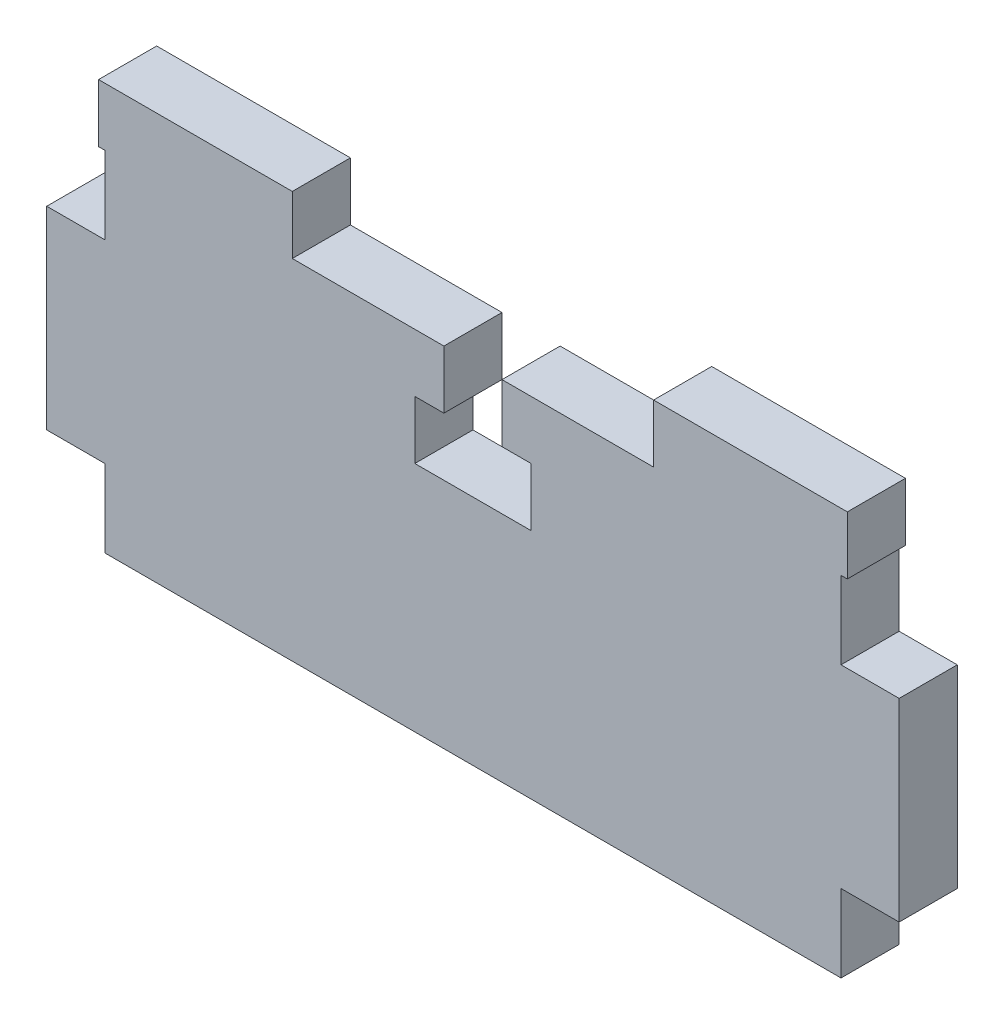
ISO-10303-21;
HEADER;
FILE_DESCRIPTION(('STEP AP214'),'2;1');
FILE_NAME('part.step','',(''),(''),'','','');
FILE_SCHEMA(('AUTOMOTIVE_DESIGN { 1 0 10303 214 1 1 1 1 }'));
ENDSEC;
DATA;
#1=APPLICATION_CONTEXT('core data for automotive mechanical design processes');
#2=APPLICATION_PROTOCOL_DEFINITION('international standard','automotive_design',2000,#1);
#3=PRODUCT_CONTEXT('',#1,'mechanical');
#4=PRODUCT('Part','Part','',(#3));
#5=PRODUCT_RELATED_PRODUCT_CATEGORY('part','',(#4));
#6=PRODUCT_DEFINITION_FORMATION('','',#4);
#7=PRODUCT_DEFINITION_CONTEXT('part definition',#1,'design');
#8=PRODUCT_DEFINITION('design','',#6,#7);
#9=PRODUCT_DEFINITION_SHAPE('','',#8);
#10=(LENGTH_UNIT() NAMED_UNIT(*) SI_UNIT(.MILLI.,.METRE.));
#11=(NAMED_UNIT(*) PLANE_ANGLE_UNIT() SI_UNIT($,.RADIAN.));
#12=(NAMED_UNIT(*) SI_UNIT($,.STERADIAN.) SOLID_ANGLE_UNIT());
#13=UNCERTAINTY_MEASURE_WITH_UNIT(LENGTH_MEASURE(1.E-05),#10,'distance_accuracy_value','');
#14=(GEOMETRIC_REPRESENTATION_CONTEXT(3) GLOBAL_UNCERTAINTY_ASSIGNED_CONTEXT((#13)) GLOBAL_UNIT_ASSIGNED_CONTEXT((#10,
#11,#12)) REPRESENTATION_CONTEXT('',''));
#15=CARTESIAN_POINT('',(0.,0.,0.));
#16=DIRECTION('',(0.,0.,1.));
#17=DIRECTION('',(1.,0.,0.));
#18=AXIS2_PLACEMENT_3D('',#15,#16,#17);
#19=CARTESIAN_POINT('',(-19.,-9.00000000000001,3.));
#20=DIRECTION('',(1.,0.,0.));
#21=DIRECTION('',(0.,1.,0.));
#22=AXIS2_PLACEMENT_3D('',#19,#20,#21);
#23=PLANE('',#22);
#24=DIRECTION('',(0.,-1.,0.));
#25=VECTOR('',#24,1.);
#26=CARTESIAN_POINT('',(-19.,-9.00000000000001,0.));
#27=LINE('',#26,#25);
#28=CARTESIAN_POINT('',(-19.,9.,0.));
#29=VERTEX_POINT('',#28);
#30=CARTESIAN_POINT('',(-19.,5.00000000000009,0.));
#31=VERTEX_POINT('',#30);
#32=EDGE_CURVE('E380',#29,#31,#27,.T.);
#33=ORIENTED_EDGE('',*,*,#32,.T.);
#34=DIRECTION('',(0.,0.,1.));
#35=VECTOR('',#34,1.);
#36=CARTESIAN_POINT('',(-19.,5.00000000000009,3.));
#37=LINE('',#36,#35);
#38=CARTESIAN_POINT('',(-19.,5.00000000000009,3.));
#39=VERTEX_POINT('',#38);
#40=EDGE_CURVE('E269',#31,#39,#37,.T.);
#41=ORIENTED_EDGE('',*,*,#40,.T.);
#42=DIRECTION('',(0.,-1.,0.));
#43=VECTOR('',#42,1.);
#44=CARTESIAN_POINT('',(-19.,-9.00000000000001,3.));
#45=LINE('',#44,#43);
#46=CARTESIAN_POINT('',(-19.,8.99999999999999,3.));
#47=VERTEX_POINT('',#46);
#48=EDGE_CURVE('E352',#47,#39,#45,.T.);
#49=ORIENTED_EDGE('',*,*,#48,.F.);
#50=DIRECTION('',(0.,0.,-1.));
#51=VECTOR('',#50,1.);
#52=CARTESIAN_POINT('',(-19.,8.99999999999999,3.));
#53=LINE('',#52,#51);
#54=EDGE_CURVE('E11',#47,#29,#53,.T.);
#55=ORIENTED_EDGE('',*,*,#54,.T.);
#56=EDGE_LOOP('',(#33,#41,#49,#55));
#57=FACE_BOUND('',#56,.T.);
#58=ADVANCED_FACE('F39',(#57),#23,.F.);
#59=CARTESIAN_POINT('',(19.,9.,3.));
#60=DIRECTION('',(0.,-1.,0.));
#61=DIRECTION('',(1.,0.,0.));
#62=AXIS2_PLACEMENT_3D('',#59,#60,#61);
#63=PLANE('',#62);
#64=DIRECTION('',(0.,0.,1.));
#65=VECTOR('',#64,1.);
#66=CARTESIAN_POINT('',(9.32500000000006,9.,3.00000000000016));
#67=LINE('',#66,#65);
#68=CARTESIAN_POINT('',(9.32500000000006,9.,0.));
#69=VERTEX_POINT('',#68);
#70=CARTESIAN_POINT('',(9.32500000000006,9.,3.));
#71=VERTEX_POINT('',#70);
#72=EDGE_CURVE('E290',#69,#71,#67,.T.);
#73=ORIENTED_EDGE('',*,*,#72,.F.);
#74=DIRECTION('',(-1.,0.,0.));
#75=VECTOR('',#74,1.);
#76=CARTESIAN_POINT('',(19.,9.,0.));
#77=LINE('',#76,#75);
#78=CARTESIAN_POINT('',(1.5,9.,0.));
#79=VERTEX_POINT('',#78);
#80=EDGE_CURVE('E388',#69,#79,#77,.T.);
#81=ORIENTED_EDGE('',*,*,#80,.T.);
#82=DIRECTION('',(0.,0.,-1.));
#83=VECTOR('',#82,1.);
#84=CARTESIAN_POINT('',(1.5,9.,3.));
#85=LINE('',#84,#83);
#86=CARTESIAN_POINT('',(1.5,9.,3.));
#87=VERTEX_POINT('',#86);
#88=EDGE_CURVE('E422',#87,#79,#85,.T.);
#89=ORIENTED_EDGE('',*,*,#88,.F.);
#90=DIRECTION('',(-1.,0.,0.));
#91=VECTOR('',#90,1.);
#92=CARTESIAN_POINT('',(19.,9.,3.));
#93=LINE('',#92,#91);
#94=EDGE_CURVE('E361',#71,#87,#93,.T.);
#95=ORIENTED_EDGE('',*,*,#94,.F.);
#96=EDGE_LOOP('',(#73,#81,#89,#95));
#97=FACE_BOUND('',#96,.T.);
#98=ADVANCED_FACE('F514',(#97),#63,.F.);
#99=CARTESIAN_POINT('',(19.,-9.,3.));
#100=DIRECTION('',(-1.,0.,0.));
#101=DIRECTION('',(0.,-1.,0.));
#102=AXIS2_PLACEMENT_3D('',#99,#100,#101);
#103=PLANE('',#102);
#104=DIRECTION('',(0.,0.,-1.));
#105=VECTOR('',#104,1.);
#106=CARTESIAN_POINT('',(19.,-5.00000000000009,3.));
#107=LINE('',#106,#105);
#108=CARTESIAN_POINT('',(19.,-5.,3.));
#109=VERTEX_POINT('',#108);
#110=CARTESIAN_POINT('',(19.,-5.,0.));
#111=VERTEX_POINT('',#110);
#112=EDGE_CURVE('E326',#109,#111,#107,.T.);
#113=ORIENTED_EDGE('',*,*,#112,.F.);
#114=DIRECTION('',(0.,1.,0.));
#115=VECTOR('',#114,1.);
#116=CARTESIAN_POINT('',(19.,-9.,3.));
#117=LINE('',#116,#115);
#118=CARTESIAN_POINT('',(19.,-9.,3.));
#119=VERTEX_POINT('',#118);
#120=EDGE_CURVE('E358',#119,#109,#117,.T.);
#121=ORIENTED_EDGE('',*,*,#120,.F.);
#122=DIRECTION('',(0.,0.,-1.));
#123=VECTOR('',#122,1.);
#124=CARTESIAN_POINT('',(19.,-9.,3.));
#125=LINE('',#124,#123);
#126=CARTESIAN_POINT('',(19.,-9.,0.));
#127=VERTEX_POINT('',#126);
#128=EDGE_CURVE('E428',#119,#127,#125,.T.);
#129=ORIENTED_EDGE('',*,*,#128,.T.);
#130=DIRECTION('',(0.,1.,0.));
#131=VECTOR('',#130,1.);
#132=CARTESIAN_POINT('',(19.,-9.,0.));
#133=LINE('',#132,#131);
#134=EDGE_CURVE('E386',#127,#111,#133,.T.);
#135=ORIENTED_EDGE('',*,*,#134,.T.);
#136=EDGE_LOOP('',(#113,#121,#129,#135));
#137=FACE_BOUND('',#136,.T.);
#138=ADVANCED_FACE('F444',(#137),#103,.F.);
#139=DIRECTION('',(0.,0.,1.));
#140=VECTOR('',#139,1.);
#141=CARTESIAN_POINT('',(19.,5.00000000000009,3.));
#142=LINE('',#141,#140);
#143=CARTESIAN_POINT('',(19.,5.00000000000009,0.));
#144=VERTEX_POINT('',#143);
#145=CARTESIAN_POINT('',(19.,5.00000000000009,3.));
#146=VERTEX_POINT('',#145);
#147=EDGE_CURVE('E321',#144,#146,#142,.T.);
#148=ORIENTED_EDGE('',*,*,#147,.F.);
#149=CARTESIAN_POINT('',(19.,9.,0.));
#150=VERTEX_POINT('',#149);
#151=EDGE_CURVE('E385',#144,#150,#133,.T.);
#152=ORIENTED_EDGE('',*,*,#151,.T.);
#153=DIRECTION('',(0.,0.,-1.));
#154=VECTOR('',#153,1.);
#155=CARTESIAN_POINT('',(19.,9.,3.));
#156=LINE('',#155,#154);
#157=CARTESIAN_POINT('',(19.,9.,3.));
#158=VERTEX_POINT('',#157);
#159=EDGE_CURVE('E425',#158,#150,#156,.T.);
#160=ORIENTED_EDGE('',*,*,#159,.F.);
#161=EDGE_CURVE('E357',#146,#158,#117,.T.);
#162=ORIENTED_EDGE('',*,*,#161,.F.);
#163=EDGE_LOOP('',(#148,#152,#160,#162));
#164=FACE_BOUND('',#163,.T.);
#165=ADVANCED_FACE('F564',(#164),#103,.F.);
#166=CARTESIAN_POINT('',(-1.5,9.,3.));
#167=DIRECTION('',(0.,-1.,0.));
#168=DIRECTION('',(1.,0.,0.));
#169=AXIS2_PLACEMENT_3D('',#166,#167,#168);
#170=PLANE('',#169);
#171=DIRECTION('',(-1.,0.,0.));
#172=VECTOR('',#171,1.);
#173=CARTESIAN_POINT('',(-1.5,9.,0.));
#174=LINE('',#173,#172);
#175=CARTESIAN_POINT('',(-1.5,9.,0.));
#176=VERTEX_POINT('',#175);
#177=CARTESIAN_POINT('',(-9.32500000000006,8.99999999999999,0.));
#178=VERTEX_POINT('',#177);
#179=EDGE_CURVE('E59',#176,#178,#174,.T.);
#180=ORIENTED_EDGE('',*,*,#179,.T.);
#181=DIRECTION('',(0.,0.,1.));
#182=VECTOR('',#181,1.);
#183=CARTESIAN_POINT('',(-9.32500000000006,9.,3.00000000000016));
#184=LINE('',#183,#182);
#185=CARTESIAN_POINT('',(-9.32500000000006,8.99999999999999,3.));
#186=VERTEX_POINT('',#185);
#187=EDGE_CURVE('E54',#178,#186,#184,.T.);
#188=ORIENTED_EDGE('',*,*,#187,.T.);
#189=DIRECTION('',(-1.,0.,0.));
#190=VECTOR('',#189,1.);
#191=CARTESIAN_POINT('',(-1.5,9.,3.));
#192=LINE('',#191,#190);
#193=CARTESIAN_POINT('',(-1.5,9.,3.));
#194=VERTEX_POINT('',#193);
#195=EDGE_CURVE('E348',#194,#186,#192,.T.);
#196=ORIENTED_EDGE('',*,*,#195,.F.);
#197=DIRECTION('',(0.,0.,-1.));
#198=VECTOR('',#197,1.);
#199=CARTESIAN_POINT('',(-1.5,9.,3.));
#200=LINE('',#199,#198);
#201=EDGE_CURVE('E377',#194,#176,#200,.T.);
#202=ORIENTED_EDGE('',*,*,#201,.T.);
#203=EDGE_LOOP('',(#180,#188,#196,#202));
#204=FACE_BOUND('',#203,.T.);
#205=ADVANCED_FACE('F41',(#204),#170,.F.);
#206=CARTESIAN_POINT('',(-19.,-5.00000000000009,3.));
#207=VERTEX_POINT('',#206);
#208=CARTESIAN_POINT('',(-19.,-9.00000000000001,3.));
#209=VERTEX_POINT('',#208);
#210=EDGE_CURVE('E350',#207,#209,#45,.T.);
#211=ORIENTED_EDGE('',*,*,#210,.F.);
#212=DIRECTION('',(0.,0.,-1.));
#213=VECTOR('',#212,1.);
#214=CARTESIAN_POINT('',(-19.,-5.00000000000009,3.));
#215=LINE('',#214,#213);
#216=CARTESIAN_POINT('',(-19.,-5.,0.));
#217=VERTEX_POINT('',#216);
#218=EDGE_CURVE('E231',#207,#217,#215,.T.);
#219=ORIENTED_EDGE('',*,*,#218,.T.);
#220=CARTESIAN_POINT('',(-19.,-9.00000000000001,0.));
#221=VERTEX_POINT('',#220);
#222=EDGE_CURVE('E379',#217,#221,#27,.T.);
#223=ORIENTED_EDGE('',*,*,#222,.T.);
#224=DIRECTION('',(0.,0.,-1.));
#225=VECTOR('',#224,1.);
#226=CARTESIAN_POINT('',(-19.,-9.00000000000001,3.));
#227=LINE('',#226,#225);
#228=EDGE_CURVE('E47',#209,#221,#227,.T.);
#229=ORIENTED_EDGE('',*,*,#228,.F.);
#230=EDGE_LOOP('',(#211,#219,#223,#229));
#231=FACE_BOUND('',#230,.T.);
#232=ADVANCED_FACE('F454',(#231),#23,.F.);
#233=CARTESIAN_POINT('',(19.,-9.,3.));
#234=DIRECTION('',(0.,1.,0.));
#235=DIRECTION('',(-1.,0.,0.));
#236=AXIS2_PLACEMENT_3D('',#233,#234,#235);
#237=PLANE('',#236);
#238=DIRECTION('',(1.,0.,0.));
#239=VECTOR('',#238,1.);
#240=CARTESIAN_POINT('',(19.,-9.,0.));
#241=LINE('',#240,#239);
#242=EDGE_CURVE('E383',#221,#127,#241,.T.);
#243=ORIENTED_EDGE('',*,*,#242,.T.);
#244=ORIENTED_EDGE('',*,*,#128,.F.);
#245=DIRECTION('',(1.,0.,0.));
#246=VECTOR('',#245,1.);
#247=CARTESIAN_POINT('',(19.,-9.,3.));
#248=LINE('',#247,#246);
#249=EDGE_CURVE('E355',#209,#119,#248,.T.);
#250=ORIENTED_EDGE('',*,*,#249,.F.);
#251=ORIENTED_EDGE('',*,*,#228,.T.);
#252=EDGE_LOOP('',(#243,#244,#250,#251));
#253=FACE_BOUND('',#252,.T.);
#254=ADVANCED_FACE('F435',(#253),#237,.F.);
#255=CARTESIAN_POINT('',(1.5,9.,3.));
#256=DIRECTION('',(1.,0.,0.));
#257=DIRECTION('',(0.,1.,0.));
#258=AXIS2_PLACEMENT_3D('',#255,#256,#257);
#259=PLANE('',#258);
#260=DIRECTION('',(0.,-1.,0.));
#261=VECTOR('',#260,1.);
#262=CARTESIAN_POINT('',(1.5,9.,0.));
#263=LINE('',#262,#261);
#264=CARTESIAN_POINT('',(1.5,5.99999999999999,0.));
#265=VERTEX_POINT('',#264);
#266=EDGE_CURVE('E390',#79,#265,#263,.T.);
#267=ORIENTED_EDGE('',*,*,#266,.T.);
#268=DIRECTION('',(0.,0.,-1.));
#269=VECTOR('',#268,1.);
#270=CARTESIAN_POINT('',(1.5,5.99999999999999,3.));
#271=LINE('',#270,#269);
#272=CARTESIAN_POINT('',(1.5,5.99999999999999,3.));
#273=VERTEX_POINT('',#272);
#274=EDGE_CURVE('E419',#273,#265,#271,.T.);
#275=ORIENTED_EDGE('',*,*,#274,.F.);
#276=DIRECTION('',(0.,-1.,0.));
#277=VECTOR('',#276,1.);
#278=CARTESIAN_POINT('',(1.5,9.,3.));
#279=LINE('',#278,#277);
#280=EDGE_CURVE('E363',#87,#273,#279,.T.);
#281=ORIENTED_EDGE('',*,*,#280,.F.);
#282=ORIENTED_EDGE('',*,*,#88,.T.);
#283=EDGE_LOOP('',(#267,#275,#281,#282));
#284=FACE_BOUND('',#283,.T.);
#285=ADVANCED_FACE('F510',(#284),#259,.F.);
#286=CARTESIAN_POINT('',(1.5,5.99999999999999,3.));
#287=DIRECTION('',(0.,1.,0.));
#288=DIRECTION('',(0.,0.,1.));
#289=AXIS2_PLACEMENT_3D('',#286,#287,#288);
#290=PLANE('',#289);
#291=DIRECTION('',(1.,0.,0.));
#292=VECTOR('',#291,1.);
#293=CARTESIAN_POINT('',(1.5,5.99999999999999,0.));
#294=LINE('',#293,#292);
#295=CARTESIAN_POINT('',(3.,5.99999999999999,0.));
#296=VERTEX_POINT('',#295);
#297=EDGE_CURVE('E392',#265,#296,#294,.T.);
#298=ORIENTED_EDGE('',*,*,#297,.T.);
#299=DIRECTION('',(0.,0.,-1.));
#300=VECTOR('',#299,1.);
#301=CARTESIAN_POINT('',(3.,5.99999999999999,3.));
#302=LINE('',#301,#300);
#303=CARTESIAN_POINT('',(3.,5.99999999999999,3.));
#304=VERTEX_POINT('',#303);
#305=EDGE_CURVE('E416',#304,#296,#302,.T.);
#306=ORIENTED_EDGE('',*,*,#305,.F.);
#307=DIRECTION('',(1.,0.,0.));
#308=VECTOR('',#307,1.);
#309=CARTESIAN_POINT('',(1.5,5.99999999999999,3.));
#310=LINE('',#309,#308);
#311=EDGE_CURVE('E365',#273,#304,#310,.T.);
#312=ORIENTED_EDGE('',*,*,#311,.F.);
#313=ORIENTED_EDGE('',*,*,#274,.T.);
#314=EDGE_LOOP('',(#298,#306,#312,#313));
#315=FACE_BOUND('',#314,.T.);
#316=ADVANCED_FACE('F504',(#315),#290,.F.);
#317=CARTESIAN_POINT('',(3.,5.99999999999999,3.));
#318=DIRECTION('',(1.,0.,0.));
#319=DIRECTION('',(0.,1.,0.));
#320=AXIS2_PLACEMENT_3D('',#317,#318,#319);
#321=PLANE('',#320);
#322=DIRECTION('',(0.,-1.,0.));
#323=VECTOR('',#322,1.);
#324=CARTESIAN_POINT('',(3.,5.99999999999999,0.));
#325=LINE('',#324,#323);
#326=CARTESIAN_POINT('',(3.,2.99999999999999,0.));
#327=VERTEX_POINT('',#326);
#328=EDGE_CURVE('E394',#296,#327,#325,.T.);
#329=ORIENTED_EDGE('',*,*,#328,.T.);
#330=DIRECTION('',(0.,0.,-1.));
#331=VECTOR('',#330,1.);
#332=CARTESIAN_POINT('',(3.,2.99999999999999,3.));
#333=LINE('',#332,#331);
#334=CARTESIAN_POINT('',(3.,2.99999999999999,3.));
#335=VERTEX_POINT('',#334);
#336=EDGE_CURVE('E413',#335,#327,#333,.T.);
#337=ORIENTED_EDGE('',*,*,#336,.F.);
#338=DIRECTION('',(0.,-1.,0.));
#339=VECTOR('',#338,1.);
#340=CARTESIAN_POINT('',(3.,5.99999999999999,3.));
#341=LINE('',#340,#339);
#342=EDGE_CURVE('E367',#304,#335,#341,.T.);
#343=ORIENTED_EDGE('',*,*,#342,.F.);
#344=ORIENTED_EDGE('',*,*,#305,.T.);
#345=EDGE_LOOP('',(#329,#337,#343,#344));
#346=FACE_BOUND('',#345,.T.);
#347=ADVANCED_FACE('F500',(#346),#321,.F.);
#348=CARTESIAN_POINT('',(-3.,3.,3.));
#349=DIRECTION('',(0.,-1.,0.));
#350=DIRECTION('',(1.,0.,0.));
#351=AXIS2_PLACEMENT_3D('',#348,#349,#350);
#352=PLANE('',#351);
#353=DIRECTION('',(-1.,0.,0.));
#354=VECTOR('',#353,1.);
#355=CARTESIAN_POINT('',(-3.,3.,0.));
#356=LINE('',#355,#354);
#357=CARTESIAN_POINT('',(-3.,3.,0.));
#358=VERTEX_POINT('',#357);
#359=EDGE_CURVE('E396',#327,#358,#356,.T.);
#360=ORIENTED_EDGE('',*,*,#359,.T.);
#361=DIRECTION('',(0.,0.,-1.));
#362=VECTOR('',#361,1.);
#363=CARTESIAN_POINT('',(-3.,3.,3.));
#364=LINE('',#363,#362);
#365=CARTESIAN_POINT('',(-3.,3.,3.));
#366=VERTEX_POINT('',#365);
#367=EDGE_CURVE('E410',#366,#358,#364,.T.);
#368=ORIENTED_EDGE('',*,*,#367,.F.);
#369=DIRECTION('',(-1.,0.,0.));
#370=VECTOR('',#369,1.);
#371=CARTESIAN_POINT('',(-3.,3.,3.));
#372=LINE('',#371,#370);
#373=EDGE_CURVE('E369',#335,#366,#372,.T.);
#374=ORIENTED_EDGE('',*,*,#373,.F.);
#375=ORIENTED_EDGE('',*,*,#336,.T.);
#376=EDGE_LOOP('',(#360,#368,#374,#375));
#377=FACE_BOUND('',#376,.T.);
#378=ADVANCED_FACE('F495',(#377),#352,.F.);
#379=CARTESIAN_POINT('',(-3.,6.,3.));
#380=DIRECTION('',(-1.,0.,0.));
#381=DIRECTION('',(0.,-1.,0.));
#382=AXIS2_PLACEMENT_3D('',#379,#380,#381);
#383=PLANE('',#382);
#384=DIRECTION('',(0.,1.,0.));
#385=VECTOR('',#384,1.);
#386=CARTESIAN_POINT('',(-3.,6.,0.));
#387=LINE('',#386,#385);
#388=CARTESIAN_POINT('',(-3.,6.,0.));
#389=VERTEX_POINT('',#388);
#390=EDGE_CURVE('E398',#358,#389,#387,.T.);
#391=ORIENTED_EDGE('',*,*,#390,.T.);
#392=DIRECTION('',(0.,0.,-1.));
#393=VECTOR('',#392,1.);
#394=CARTESIAN_POINT('',(-3.,6.,3.));
#395=LINE('',#394,#393);
#396=CARTESIAN_POINT('',(-3.,6.,3.));
#397=VERTEX_POINT('',#396);
#398=EDGE_CURVE('E407',#397,#389,#395,.T.);
#399=ORIENTED_EDGE('',*,*,#398,.F.);
#400=DIRECTION('',(0.,1.,0.));
#401=VECTOR('',#400,1.);
#402=CARTESIAN_POINT('',(-3.,6.,3.));
#403=LINE('',#402,#401);
#404=EDGE_CURVE('E371',#366,#397,#403,.T.);
#405=ORIENTED_EDGE('',*,*,#404,.F.);
#406=ORIENTED_EDGE('',*,*,#367,.T.);
#407=EDGE_LOOP('',(#391,#399,#405,#406));
#408=FACE_BOUND('',#407,.T.);
#409=ADVANCED_FACE('F489',(#408),#383,.F.);
#410=CARTESIAN_POINT('',(-1.5,6.,3.));
#411=DIRECTION('',(0.,1.,0.));
#412=DIRECTION('',(0.,0.,1.));
#413=AXIS2_PLACEMENT_3D('',#410,#411,#412);
#414=PLANE('',#413);
#415=DIRECTION('',(1.,0.,0.));
#416=VECTOR('',#415,1.);
#417=CARTESIAN_POINT('',(-1.5,6.,0.));
#418=LINE('',#417,#416);
#419=CARTESIAN_POINT('',(-1.5,6.,0.));
#420=VERTEX_POINT('',#419);
#421=EDGE_CURVE('E400',#389,#420,#418,.T.);
#422=ORIENTED_EDGE('',*,*,#421,.T.);
#423=DIRECTION('',(0.,0.,-1.));
#424=VECTOR('',#423,1.);
#425=CARTESIAN_POINT('',(-1.5,6.,3.));
#426=LINE('',#425,#424);
#427=CARTESIAN_POINT('',(-1.5,6.,3.));
#428=VERTEX_POINT('',#427);
#429=EDGE_CURVE('E404',#428,#420,#426,.T.);
#430=ORIENTED_EDGE('',*,*,#429,.F.);
#431=DIRECTION('',(1.,0.,0.));
#432=VECTOR('',#431,1.);
#433=CARTESIAN_POINT('',(-1.5,6.,3.));
#434=LINE('',#433,#432);
#435=EDGE_CURVE('E373',#397,#428,#434,.T.);
#436=ORIENTED_EDGE('',*,*,#435,.F.);
#437=ORIENTED_EDGE('',*,*,#398,.T.);
#438=EDGE_LOOP('',(#422,#430,#436,#437));
#439=FACE_BOUND('',#438,.T.);
#440=ADVANCED_FACE('F485',(#439),#414,.F.);
#441=CARTESIAN_POINT('',(-1.5,9.,3.));
#442=DIRECTION('',(-1.,0.,0.));
#443=DIRECTION('',(0.,-1.,0.));
#444=AXIS2_PLACEMENT_3D('',#441,#442,#443);
#445=PLANE('',#444);
#446=DIRECTION('',(0.,1.,0.));
#447=VECTOR('',#446,1.);
#448=CARTESIAN_POINT('',(-1.5,9.,0.));
#449=LINE('',#448,#447);
#450=EDGE_CURVE('E351',#420,#176,#449,.T.);
#451=ORIENTED_EDGE('',*,*,#450,.T.);
#452=ORIENTED_EDGE('',*,*,#201,.F.);
#453=DIRECTION('',(0.,1.,0.));
#454=VECTOR('',#453,1.);
#455=CARTESIAN_POINT('',(-1.5,9.,3.));
#456=LINE('',#455,#454);
#457=EDGE_CURVE('E375',#428,#194,#456,.T.);
#458=ORIENTED_EDGE('',*,*,#457,.F.);
#459=ORIENTED_EDGE('',*,*,#429,.T.);
#460=EDGE_LOOP('',(#451,#452,#458,#459));
#461=FACE_BOUND('',#460,.T.);
#462=ADVANCED_FACE('F481',(#461),#445,.F.);
#463=CARTESIAN_POINT('',(0.,0.,3.));
#464=DIRECTION('',(0.,0.,-1.));
#465=DIRECTION('',(-1.,0.,0.));
#466=AXIS2_PLACEMENT_3D('',#463,#464,#465);
#467=PLANE('',#466);
#468=ORIENTED_EDGE('',*,*,#195,.T.);
#469=DIRECTION('',(0.,-1.,0.));
#470=VECTOR('',#469,1.);
#471=CARTESIAN_POINT('',(-9.32500000000006,12.,3.00000000000016));
#472=LINE('',#471,#470);
#473=CARTESIAN_POINT('',(-9.32500000000006,12.,3.00000000000016));
#474=VERTEX_POINT('',#473);
#475=EDGE_CURVE('E251',#474,#186,#472,.T.);
#476=ORIENTED_EDGE('',*,*,#475,.F.);
#477=DIRECTION('',(-1.,0.,0.));
#478=VECTOR('',#477,1.);
#479=CARTESIAN_POINT('',(-19.3250000000001,12.,3.00000000000016));
#480=LINE('',#479,#478);
#481=CARTESIAN_POINT('',(-19.3250000000001,12.,3.00000000000016));
#482=VERTEX_POINT('',#481);
#483=EDGE_CURVE('E241',#474,#482,#480,.T.);
#484=ORIENTED_EDGE('',*,*,#483,.T.);
#485=DIRECTION('',(0.,-1.,0.));
#486=VECTOR('',#485,1.);
#487=CARTESIAN_POINT('',(-19.3250000000001,12.,3.00000000000016));
#488=LINE('',#487,#486);
#489=CARTESIAN_POINT('',(-19.3250000000001,9.,3.00000000000016));
#490=VERTEX_POINT('',#489);
#491=EDGE_CURVE('E261',#482,#490,#488,.T.);
#492=ORIENTED_EDGE('',*,*,#491,.T.);
#493=DIRECTION('',(-1.,0.,0.));
#494=VECTOR('',#493,1.);
#495=CARTESIAN_POINT('',(-19.3250000000001,9.,3.00000000000016));
#496=LINE('',#495,#494);
#497=EDGE_CURVE('E242',#47,#490,#496,.T.);
#498=ORIENTED_EDGE('',*,*,#497,.F.);
#499=ORIENTED_EDGE('',*,*,#48,.T.);
#500=DIRECTION('',(1.,0.,0.));
#501=VECTOR('',#500,1.);
#502=CARTESIAN_POINT('',(-22.,5.00000000000009,3.));
#503=LINE('',#502,#501);
#504=CARTESIAN_POINT('',(-22.,5.00000000000009,3.));
#505=VERTEX_POINT('',#504);
#506=EDGE_CURVE('E284',#505,#39,#503,.T.);
#507=ORIENTED_EDGE('',*,*,#506,.F.);
#508=DIRECTION('',(0.,-1.,0.));
#509=VECTOR('',#508,1.);
#510=CARTESIAN_POINT('',(-22.,-5.00000000000009,3.));
#511=LINE('',#510,#509);
#512=CARTESIAN_POINT('',(-22.,-5.00000000000009,3.));
#513=VERTEX_POINT('',#512);
#514=EDGE_CURVE('E272',#505,#513,#511,.T.);
#515=ORIENTED_EDGE('',*,*,#514,.T.);
#516=DIRECTION('',(1.,0.,0.));
#517=VECTOR('',#516,1.);
#518=CARTESIAN_POINT('',(-22.,-5.00000000000009,3.));
#519=LINE('',#518,#517);
#520=EDGE_CURVE('E286',#513,#207,#519,.T.);
#521=ORIENTED_EDGE('',*,*,#520,.T.);
#522=ORIENTED_EDGE('',*,*,#210,.T.);
#523=ORIENTED_EDGE('',*,*,#249,.T.);
#524=ORIENTED_EDGE('',*,*,#120,.T.);
#525=DIRECTION('',(-1.,0.,0.));
#526=VECTOR('',#525,1.);
#527=CARTESIAN_POINT('',(22.,-5.00000000000009,3.));
#528=LINE('',#527,#526);
#529=CARTESIAN_POINT('',(22.,-5.00000000000009,3.));
#530=VERTEX_POINT('',#529);
#531=EDGE_CURVE('E339',#530,#109,#528,.T.);
#532=ORIENTED_EDGE('',*,*,#531,.F.);
#533=DIRECTION('',(0.,-1.,0.));
#534=VECTOR('',#533,1.);
#535=CARTESIAN_POINT('',(22.,-5.00000000000009,3.));
#536=LINE('',#535,#534);
#537=CARTESIAN_POINT('',(22.,5.00000000000009,3.));
#538=VERTEX_POINT('',#537);
#539=EDGE_CURVE('E328',#538,#530,#536,.T.);
#540=ORIENTED_EDGE('',*,*,#539,.F.);
#541=DIRECTION('',(-1.,0.,0.));
#542=VECTOR('',#541,1.);
#543=CARTESIAN_POINT('',(22.,5.00000000000009,3.));
#544=LINE('',#543,#542);
#545=EDGE_CURVE('E342',#538,#146,#544,.T.);
#546=ORIENTED_EDGE('',*,*,#545,.T.);
#547=ORIENTED_EDGE('',*,*,#161,.T.);
#548=DIRECTION('',(1.,0.,0.));
#549=VECTOR('',#548,1.);
#550=CARTESIAN_POINT('',(19.3250000000001,9.,3.00000000000016));
#551=LINE('',#550,#549);
#552=CARTESIAN_POINT('',(19.3250000000001,9.,3.00000000000016));
#553=VERTEX_POINT('',#552);
#554=EDGE_CURVE('E304',#158,#553,#551,.T.);
#555=ORIENTED_EDGE('',*,*,#554,.T.);
#556=DIRECTION('',(0.,-1.,0.));
#557=VECTOR('',#556,1.);
#558=CARTESIAN_POINT('',(19.3250000000001,12.,3.00000000000016));
#559=LINE('',#558,#557);
#560=CARTESIAN_POINT('',(19.3250000000001,12.,3.00000000000016));
#561=VERTEX_POINT('',#560);
#562=EDGE_CURVE('E315',#561,#553,#559,.T.);
#563=ORIENTED_EDGE('',*,*,#562,.F.);
#564=DIRECTION('',(1.,0.,0.));
#565=VECTOR('',#564,1.);
#566=CARTESIAN_POINT('',(19.3250000000001,12.,3.00000000000016));
#567=LINE('',#566,#565);
#568=CARTESIAN_POINT('',(9.32500000000006,12.,3.00000000000016));
#569=VERTEX_POINT('',#568);
#570=EDGE_CURVE('E294',#569,#561,#567,.T.);
#571=ORIENTED_EDGE('',*,*,#570,.F.);
#572=DIRECTION('',(0.,-1.,0.));
#573=VECTOR('',#572,1.);
#574=CARTESIAN_POINT('',(9.32500000000006,12.,3.00000000000016));
#575=LINE('',#574,#573);
#576=EDGE_CURVE('E318',#569,#71,#575,.T.);
#577=ORIENTED_EDGE('',*,*,#576,.T.);
#578=ORIENTED_EDGE('',*,*,#94,.T.);
#579=ORIENTED_EDGE('',*,*,#280,.T.);
#580=ORIENTED_EDGE('',*,*,#311,.T.);
#581=ORIENTED_EDGE('',*,*,#342,.T.);
#582=ORIENTED_EDGE('',*,*,#373,.T.);
#583=ORIENTED_EDGE('',*,*,#404,.T.);
#584=ORIENTED_EDGE('',*,*,#435,.T.);
#585=ORIENTED_EDGE('',*,*,#457,.T.);
#586=EDGE_LOOP('',(#468,#476,#484,#492,#498,#499,#507,#515,#521,#522,#523,#524,#532,#540,#546,
#547,#555,#563,#571,#577,#578,#579,#580,#581,#582,#583,#584,#585));
#587=FACE_BOUND('',#586,.T.);
#588=ADVANCED_FACE('F452',(#587),#467,.F.);
#589=CARTESIAN_POINT('',(0.,0.,0.));
#590=DIRECTION('',(0.,0.,-1.));
#591=DIRECTION('',(-1.,0.,0.));
#592=AXIS2_PLACEMENT_3D('',#589,#590,#591);
#593=PLANE('',#592);
#594=ORIENTED_EDGE('',*,*,#179,.F.);
#595=ORIENTED_EDGE('',*,*,#450,.F.);
#596=ORIENTED_EDGE('',*,*,#421,.F.);
#597=ORIENTED_EDGE('',*,*,#390,.F.);
#598=ORIENTED_EDGE('',*,*,#359,.F.);
#599=ORIENTED_EDGE('',*,*,#328,.F.);
#600=ORIENTED_EDGE('',*,*,#297,.F.);
#601=ORIENTED_EDGE('',*,*,#266,.F.);
#602=ORIENTED_EDGE('',*,*,#80,.F.);
#603=DIRECTION('',(0.,-1.,0.));
#604=VECTOR('',#603,1.);
#605=CARTESIAN_POINT('',(9.32500000000006,12.,0.));
#606=LINE('',#605,#604);
#607=CARTESIAN_POINT('',(9.32500000000006,12.,0.));
#608=VERTEX_POINT('',#607);
#609=EDGE_CURVE('E301',#608,#69,#606,.T.);
#610=ORIENTED_EDGE('',*,*,#609,.F.);
#611=DIRECTION('',(-1.,0.,0.));
#612=VECTOR('',#611,1.);
#613=CARTESIAN_POINT('',(19.3250000000001,12.,0.));
#614=LINE('',#613,#612);
#615=CARTESIAN_POINT('',(19.3250000000001,12.,0.));
#616=VERTEX_POINT('',#615);
#617=EDGE_CURVE('E299',#616,#608,#614,.T.);
#618=ORIENTED_EDGE('',*,*,#617,.F.);
#619=DIRECTION('',(0.,-1.,0.));
#620=VECTOR('',#619,1.);
#621=CARTESIAN_POINT('',(19.3250000000001,12.,0.));
#622=LINE('',#621,#620);
#623=CARTESIAN_POINT('',(19.3250000000001,9.,0.));
#624=VERTEX_POINT('',#623);
#625=EDGE_CURVE('E312',#616,#624,#622,.T.);
#626=ORIENTED_EDGE('',*,*,#625,.T.);
#627=DIRECTION('',(-1.,0.,0.));
#628=VECTOR('',#627,1.);
#629=CARTESIAN_POINT('',(19.3250000000001,9.,0.));
#630=LINE('',#629,#628);
#631=EDGE_CURVE('E295',#624,#150,#630,.T.);
#632=ORIENTED_EDGE('',*,*,#631,.T.);
#633=ORIENTED_EDGE('',*,*,#151,.F.);
#634=DIRECTION('',(-1.,0.,0.));
#635=VECTOR('',#634,1.);
#636=CARTESIAN_POINT('',(22.,5.00000000000009,0.));
#637=LINE('',#636,#635);
#638=CARTESIAN_POINT('',(22.,5.00000000000009,0.));
#639=VERTEX_POINT('',#638);
#640=EDGE_CURVE('E345',#639,#144,#637,.T.);
#641=ORIENTED_EDGE('',*,*,#640,.F.);
#642=DIRECTION('',(0.,1.,0.));
#643=VECTOR('',#642,1.);
#644=CARTESIAN_POINT('',(22.,-4.99999999999992,0.));
#645=LINE('',#644,#643);
#646=CARTESIAN_POINT('',(22.,-4.99999999999992,0.));
#647=VERTEX_POINT('',#646);
#648=EDGE_CURVE('E322',#647,#639,#645,.T.);
#649=ORIENTED_EDGE('',*,*,#648,.F.);
#650=DIRECTION('',(-1.,0.,0.));
#651=VECTOR('',#650,1.);
#652=CARTESIAN_POINT('',(22.,-4.99999999999992,0.));
#653=LINE('',#652,#651);
#654=EDGE_CURVE('E332',#647,#111,#653,.T.);
#655=ORIENTED_EDGE('',*,*,#654,.T.);
#656=ORIENTED_EDGE('',*,*,#134,.F.);
#657=ORIENTED_EDGE('',*,*,#242,.F.);
#658=ORIENTED_EDGE('',*,*,#222,.F.);
#659=DIRECTION('',(1.,0.,0.));
#660=VECTOR('',#659,1.);
#661=CARTESIAN_POINT('',(-22.,-4.99999999999992,0.));
#662=LINE('',#661,#660);
#663=CARTESIAN_POINT('',(-22.,-4.99999999999992,0.));
#664=VERTEX_POINT('',#663);
#665=EDGE_CURVE('E288',#664,#217,#662,.T.);
#666=ORIENTED_EDGE('',*,*,#665,.F.);
#667=DIRECTION('',(0.,1.,0.));
#668=VECTOR('',#667,1.);
#669=CARTESIAN_POINT('',(-22.,-4.99999999999992,0.));
#670=LINE('',#669,#668);
#671=CARTESIAN_POINT('',(-22.,5.00000000000009,0.));
#672=VERTEX_POINT('',#671);
#673=EDGE_CURVE('E265',#664,#672,#670,.T.);
#674=ORIENTED_EDGE('',*,*,#673,.T.);
#675=DIRECTION('',(1.,0.,0.));
#676=VECTOR('',#675,1.);
#677=CARTESIAN_POINT('',(-22.,5.00000000000009,0.));
#678=LINE('',#677,#676);
#679=EDGE_CURVE('E278',#672,#31,#678,.T.);
#680=ORIENTED_EDGE('',*,*,#679,.T.);
#681=ORIENTED_EDGE('',*,*,#32,.F.);
#682=DIRECTION('',(1.,0.,0.));
#683=VECTOR('',#682,1.);
#684=CARTESIAN_POINT('',(-19.3250000000001,9.,0.));
#685=LINE('',#684,#683);
#686=CARTESIAN_POINT('',(-19.3250000000001,9.,0.));
#687=VERTEX_POINT('',#686);
#688=EDGE_CURVE('E253',#687,#29,#685,.T.);
#689=ORIENTED_EDGE('',*,*,#688,.F.);
#690=DIRECTION('',(0.,-1.,0.));
#691=VECTOR('',#690,1.);
#692=CARTESIAN_POINT('',(-19.3250000000001,12.,0.));
#693=LINE('',#692,#691);
#694=CARTESIAN_POINT('',(-19.3250000000001,12.,0.));
#695=VERTEX_POINT('',#694);
#696=EDGE_CURVE('E232',#695,#687,#693,.T.);
#697=ORIENTED_EDGE('',*,*,#696,.F.);
#698=DIRECTION('',(1.,0.,0.));
#699=VECTOR('',#698,1.);
#700=CARTESIAN_POINT('',(-19.3250000000001,12.,0.));
#701=LINE('',#700,#699);
#702=CARTESIAN_POINT('',(-9.32500000000006,12.,0.));
#703=VERTEX_POINT('',#702);
#704=EDGE_CURVE('E238',#695,#703,#701,.T.);
#705=ORIENTED_EDGE('',*,*,#704,.T.);
#706=DIRECTION('',(0.,-1.,0.));
#707=VECTOR('',#706,1.);
#708=CARTESIAN_POINT('',(-9.32500000000006,12.,0.));
#709=LINE('',#708,#707);
#710=EDGE_CURVE('E223',#703,#178,#709,.T.);
#711=ORIENTED_EDGE('',*,*,#710,.T.);
#712=EDGE_LOOP('',(#594,#595,#596,#597,#598,#599,#600,#601,#602,#610,#618,#626,#632,#633,#641,
#649,#655,#656,#657,#658,#666,#674,#680,#681,#689,#697,#705,#711));
#713=FACE_BOUND('',#712,.T.);
#714=ADVANCED_FACE('F244',(#713),#593,.T.);
#715=CARTESIAN_POINT('',(22.,5.00000000000009,3.));
#716=DIRECTION('',(0.,-1.,0.));
#717=DIRECTION('',(0.,0.,-1.));
#718=AXIS2_PLACEMENT_3D('',#715,#716,#717);
#719=PLANE('',#718);
#720=ORIENTED_EDGE('',*,*,#147,.T.);
#721=ORIENTED_EDGE('',*,*,#545,.F.);
#722=DIRECTION('',(0.,0.,1.));
#723=VECTOR('',#722,1.);
#724=CARTESIAN_POINT('',(22.,5.00000000000009,3.));
#725=LINE('',#724,#723);
#726=EDGE_CURVE('E325',#639,#538,#725,.T.);
#727=ORIENTED_EDGE('',*,*,#726,.F.);
#728=ORIENTED_EDGE('',*,*,#640,.T.);
#729=EDGE_LOOP('',(#720,#721,#727,#728));
#730=FACE_BOUND('',#729,.T.);
#731=ADVANCED_FACE('F537',(#730),#719,.F.);
#732=CARTESIAN_POINT('',(22.,-5.00000000000009,3.));
#733=DIRECTION('',(0.,1.,0.));
#734=DIRECTION('',(0.,0.,1.));
#735=AXIS2_PLACEMENT_3D('',#732,#733,#734);
#736=PLANE('',#735);
#737=ORIENTED_EDGE('',*,*,#112,.T.);
#738=ORIENTED_EDGE('',*,*,#654,.F.);
#739=DIRECTION('',(0.,0.,-1.));
#740=VECTOR('',#739,1.);
#741=CARTESIAN_POINT('',(22.,-5.00000000000009,3.));
#742=LINE('',#741,#740);
#743=EDGE_CURVE('E330',#530,#647,#742,.T.);
#744=ORIENTED_EDGE('',*,*,#743,.F.);
#745=ORIENTED_EDGE('',*,*,#531,.T.);
#746=EDGE_LOOP('',(#737,#738,#744,#745));
#747=FACE_BOUND('',#746,.T.);
#748=ADVANCED_FACE('F447',(#747),#736,.F.);
#749=CARTESIAN_POINT('',(22.,0.,0.));
#750=DIRECTION('',(-1.,0.,0.));
#751=DIRECTION('',(0.,0.,1.));
#752=AXIS2_PLACEMENT_3D('',#749,#750,#751);
#753=PLANE('',#752);
#754=ORIENTED_EDGE('',*,*,#648,.T.);
#755=ORIENTED_EDGE('',*,*,#726,.T.);
#756=ORIENTED_EDGE('',*,*,#539,.T.);
#757=ORIENTED_EDGE('',*,*,#743,.T.);
#758=EDGE_LOOP('',(#754,#755,#756,#757));
#759=FACE_BOUND('',#758,.T.);
#760=ADVANCED_FACE('F540',(#759),#753,.F.);
#761=CARTESIAN_POINT('',(0.,9.,0.));
#762=DIRECTION('',(0.,1.,0.));
#763=DIRECTION('',(-1.,0.,0.));
#764=AXIS2_PLACEMENT_3D('',#761,#762,#763);
#765=PLANE('',#764);
#766=ORIENTED_EDGE('',*,*,#554,.F.);
#767=ORIENTED_EDGE('',*,*,#159,.T.);
#768=ORIENTED_EDGE('',*,*,#631,.F.);
#769=DIRECTION('',(0.,0.,-1.));
#770=VECTOR('',#769,1.);
#771=CARTESIAN_POINT('',(19.3250000000001,9.,3.00000000000016));
#772=LINE('',#771,#770);
#773=EDGE_CURVE('E306',#553,#624,#772,.T.);
#774=ORIENTED_EDGE('',*,*,#773,.F.);
#775=EDGE_LOOP('',(#766,#767,#768,#774));
#776=FACE_BOUND('',#775,.T.);
#777=ADVANCED_FACE('F531',(#776),#765,.F.);
#778=CARTESIAN_POINT('',(9.32500000000006,12.,3.00000000000016));
#779=DIRECTION('',(1.,0.,0.));
#780=DIRECTION('',(0.,1.,0.));
#781=AXIS2_PLACEMENT_3D('',#778,#779,#780);
#782=PLANE('',#781);
#783=ORIENTED_EDGE('',*,*,#72,.T.);
#784=ORIENTED_EDGE('',*,*,#576,.F.);
#785=DIRECTION('',(0.,0.,1.));
#786=VECTOR('',#785,1.);
#787=CARTESIAN_POINT('',(9.32500000000006,12.,3.00000000000016));
#788=LINE('',#787,#786);
#789=EDGE_CURVE('E291',#608,#569,#788,.T.);
#790=ORIENTED_EDGE('',*,*,#789,.F.);
#791=ORIENTED_EDGE('',*,*,#609,.T.);
#792=EDGE_LOOP('',(#783,#784,#790,#791));
#793=FACE_BOUND('',#792,.T.);
#794=ADVANCED_FACE('F518',(#793),#782,.F.);
#795=CARTESIAN_POINT('',(19.3250000000001,12.,3.00000000000016));
#796=DIRECTION('',(-1.,0.,0.));
#797=DIRECTION('',(0.,-1.,0.));
#798=AXIS2_PLACEMENT_3D('',#795,#796,#797);
#799=PLANE('',#798);
#800=ORIENTED_EDGE('',*,*,#773,.T.);
#801=ORIENTED_EDGE('',*,*,#625,.F.);
#802=DIRECTION('',(0.,0.,-1.));
#803=VECTOR('',#802,1.);
#804=CARTESIAN_POINT('',(19.3250000000001,12.,3.00000000000016));
#805=LINE('',#804,#803);
#806=EDGE_CURVE('E297',#561,#616,#805,.T.);
#807=ORIENTED_EDGE('',*,*,#806,.F.);
#808=ORIENTED_EDGE('',*,*,#562,.T.);
#809=EDGE_LOOP('',(#800,#801,#807,#808));
#810=FACE_BOUND('',#809,.T.);
#811=ADVANCED_FACE('F527',(#810),#799,.F.);
#812=CARTESIAN_POINT('',(0.,12.,0.));
#813=DIRECTION('',(0.,1.,0.));
#814=DIRECTION('',(-1.,0.,0.));
#815=AXIS2_PLACEMENT_3D('',#812,#813,#814);
#816=PLANE('',#815);
#817=ORIENTED_EDGE('',*,*,#789,.T.);
#818=ORIENTED_EDGE('',*,*,#570,.T.);
#819=ORIENTED_EDGE('',*,*,#806,.T.);
#820=ORIENTED_EDGE('',*,*,#617,.T.);
#821=EDGE_LOOP('',(#817,#818,#819,#820));
#822=FACE_BOUND('',#821,.T.);
#823=ADVANCED_FACE('F523',(#822),#816,.T.);
#824=CARTESIAN_POINT('',(-22.,-5.00000000000009,3.));
#825=DIRECTION('',(0.,-1.,0.));
#826=DIRECTION('',(0.,0.,-1.));
#827=AXIS2_PLACEMENT_3D('',#824,#825,#826);
#828=PLANE('',#827);
#829=ORIENTED_EDGE('',*,*,#218,.F.);
#830=ORIENTED_EDGE('',*,*,#520,.F.);
#831=DIRECTION('',(0.,0.,-1.));
#832=VECTOR('',#831,1.);
#833=CARTESIAN_POINT('',(-22.,-5.00000000000009,3.));
#834=LINE('',#833,#832);
#835=EDGE_CURVE('E268',#513,#664,#834,.T.);
#836=ORIENTED_EDGE('',*,*,#835,.T.);
#837=ORIENTED_EDGE('',*,*,#665,.T.);
#838=EDGE_LOOP('',(#829,#830,#836,#837));
#839=FACE_BOUND('',#838,.T.);
#840=ADVANCED_FACE('F456',(#839),#828,.T.);
#841=CARTESIAN_POINT('',(-22.,5.00000000000009,3.));
#842=DIRECTION('',(0.,1.,0.));
#843=DIRECTION('',(0.,0.,1.));
#844=AXIS2_PLACEMENT_3D('',#841,#842,#843);
#845=PLANE('',#844);
#846=ORIENTED_EDGE('',*,*,#40,.F.);
#847=ORIENTED_EDGE('',*,*,#679,.F.);
#848=DIRECTION('',(0.,0.,1.));
#849=VECTOR('',#848,1.);
#850=CARTESIAN_POINT('',(-22.,5.00000000000009,3.));
#851=LINE('',#850,#849);
#852=EDGE_CURVE('E275',#672,#505,#851,.T.);
#853=ORIENTED_EDGE('',*,*,#852,.T.);
#854=ORIENTED_EDGE('',*,*,#506,.T.);
#855=EDGE_LOOP('',(#846,#847,#853,#854));
#856=FACE_BOUND('',#855,.T.);
#857=ADVANCED_FACE('F465',(#856),#845,.T.);
#858=CARTESIAN_POINT('',(-22.,0.,0.));
#859=DIRECTION('',(1.,0.,0.));
#860=DIRECTION('',(0.,0.,1.));
#861=AXIS2_PLACEMENT_3D('',#858,#859,#860);
#862=PLANE('',#861);
#863=ORIENTED_EDGE('',*,*,#673,.F.);
#864=ORIENTED_EDGE('',*,*,#835,.F.);
#865=ORIENTED_EDGE('',*,*,#514,.F.);
#866=ORIENTED_EDGE('',*,*,#852,.F.);
#867=EDGE_LOOP('',(#863,#864,#865,#866));
#868=FACE_BOUND('',#867,.T.);
#869=ADVANCED_FACE('F461',(#868),#862,.F.);
#870=CARTESIAN_POINT('',(0.,9.,0.));
#871=DIRECTION('',(0.,1.,0.));
#872=DIRECTION('',(1.,0.,0.));
#873=AXIS2_PLACEMENT_3D('',#870,#871,#872);
#874=PLANE('',#873);
#875=ORIENTED_EDGE('',*,*,#688,.T.);
#876=ORIENTED_EDGE('',*,*,#54,.F.);
#877=ORIENTED_EDGE('',*,*,#497,.T.);
#878=DIRECTION('',(0.,0.,-1.));
#879=VECTOR('',#878,1.);
#880=CARTESIAN_POINT('',(-19.3250000000001,9.,3.00000000000016));
#881=LINE('',#880,#879);
#882=EDGE_CURVE('E256',#490,#687,#881,.T.);
#883=ORIENTED_EDGE('',*,*,#882,.T.);
#884=EDGE_LOOP('',(#875,#876,#877,#883));
#885=FACE_BOUND('',#884,.T.);
#886=ADVANCED_FACE('F470',(#885),#874,.F.);
#887=CARTESIAN_POINT('',(-9.32500000000006,12.,3.00000000000016));
#888=DIRECTION('',(1.,0.,0.));
#889=DIRECTION('',(0.,1.,0.));
#890=AXIS2_PLACEMENT_3D('',#887,#888,#889);
#891=PLANE('',#890);
#892=ORIENTED_EDGE('',*,*,#187,.F.);
#893=ORIENTED_EDGE('',*,*,#710,.F.);
#894=DIRECTION('',(0.,0.,1.));
#895=VECTOR('',#894,1.);
#896=CARTESIAN_POINT('',(-9.32500000000006,12.,3.00000000000016));
#897=LINE('',#896,#895);
#898=EDGE_CURVE('E227',#703,#474,#897,.T.);
#899=ORIENTED_EDGE('',*,*,#898,.T.);
#900=ORIENTED_EDGE('',*,*,#475,.T.);
#901=EDGE_LOOP('',(#892,#893,#899,#900));
#902=FACE_BOUND('',#901,.T.);
#903=ADVANCED_FACE('F225',(#902),#891,.T.);
#904=CARTESIAN_POINT('',(-19.3250000000001,12.,3.00000000000016));
#905=DIRECTION('',(-1.,0.,0.));
#906=DIRECTION('',(0.,-1.,0.));
#907=AXIS2_PLACEMENT_3D('',#904,#905,#906);
#908=PLANE('',#907);
#909=ORIENTED_EDGE('',*,*,#882,.F.);
#910=ORIENTED_EDGE('',*,*,#491,.F.);
#911=DIRECTION('',(0.,0.,-1.));
#912=VECTOR('',#911,1.);
#913=CARTESIAN_POINT('',(-19.3250000000001,12.,3.00000000000016));
#914=LINE('',#913,#912);
#915=EDGE_CURVE('E246',#482,#695,#914,.T.);
#916=ORIENTED_EDGE('',*,*,#915,.T.);
#917=ORIENTED_EDGE('',*,*,#696,.T.);
#918=EDGE_LOOP('',(#909,#910,#916,#917));
#919=FACE_BOUND('',#918,.T.);
#920=ADVANCED_FACE('F474',(#919),#908,.T.);
#921=CARTESIAN_POINT('',(0.,12.,0.));
#922=DIRECTION('',(0.,1.,0.));
#923=DIRECTION('',(1.,0.,0.));
#924=AXIS2_PLACEMENT_3D('',#921,#922,#923);
#925=PLANE('',#924);
#926=ORIENTED_EDGE('',*,*,#898,.F.);
#927=ORIENTED_EDGE('',*,*,#704,.F.);
#928=ORIENTED_EDGE('',*,*,#915,.F.);
#929=ORIENTED_EDGE('',*,*,#483,.F.);
#930=EDGE_LOOP('',(#926,#927,#928,#929));
#931=FACE_BOUND('',#930,.T.);
#932=ADVANCED_FACE('F236',(#931),#925,.T.);
#933=CLOSED_SHELL('',(#58,#98,#138,#165,#205,#232,#254,#285,#316,#347,#378,#409,#440,#462,#588,
#714,#731,#748,#760,#777,#794,#811,#823,#840,#857,#869,#886,#903,#920,#932));
#934=MANIFOLD_SOLID_BREP('B2',#933);
#935=ADVANCED_BREP_SHAPE_REPRESENTATION('',(#18,#934),#14);
#936=SHAPE_DEFINITION_REPRESENTATION(#9,#935);
ENDSEC;
END-ISO-10303-21;
